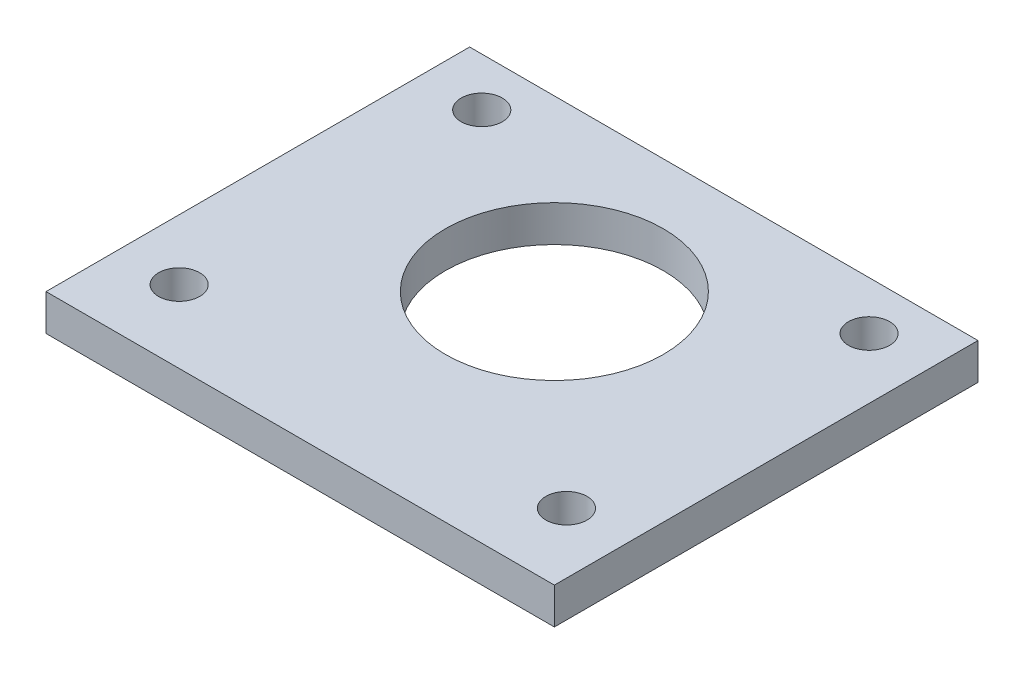
ISO-10303-21;
HEADER;
FILE_DESCRIPTION(('STEP AP214'),'2;1');
FILE_NAME('part.step','',(''),(''),'','','');
FILE_SCHEMA(('AUTOMOTIVE_DESIGN { 1 0 10303 214 1 1 1 1 }'));
ENDSEC;
DATA;
#1=APPLICATION_CONTEXT('core data for automotive mechanical design processes');
#2=APPLICATION_PROTOCOL_DEFINITION('international standard','automotive_design',2000,#1);
#3=PRODUCT_CONTEXT('',#1,'mechanical');
#4=PRODUCT('Part','Part','',(#3));
#5=PRODUCT_RELATED_PRODUCT_CATEGORY('part','',(#4));
#6=PRODUCT_DEFINITION_FORMATION('','',#4);
#7=PRODUCT_DEFINITION_CONTEXT('part definition',#1,'design');
#8=PRODUCT_DEFINITION('design','',#6,#7);
#9=PRODUCT_DEFINITION_SHAPE('','',#8);
#10=(LENGTH_UNIT() NAMED_UNIT(*) SI_UNIT(.MILLI.,.METRE.));
#11=(NAMED_UNIT(*) PLANE_ANGLE_UNIT() SI_UNIT($,.RADIAN.));
#12=(NAMED_UNIT(*) SI_UNIT($,.STERADIAN.) SOLID_ANGLE_UNIT());
#13=UNCERTAINTY_MEASURE_WITH_UNIT(LENGTH_MEASURE(1.E-05),#10,'distance_accuracy_value','');
#14=(GEOMETRIC_REPRESENTATION_CONTEXT(3) GLOBAL_UNCERTAINTY_ASSIGNED_CONTEXT((#13)) GLOBAL_UNIT_ASSIGNED_CONTEXT((#10,
#11,#12)) REPRESENTATION_CONTEXT('',''));
#15=CARTESIAN_POINT('',(0.,0.,0.));
#16=DIRECTION('',(0.,0.,1.));
#17=DIRECTION('',(1.,0.,0.));
#18=AXIS2_PLACEMENT_3D('',#15,#16,#17);
#19=CARTESIAN_POINT('',(42.,0.00630000000001,0.));
#20=DIRECTION('',(0.,1.,0.));
#21=DIRECTION('',(0.,0.,1.));
#22=AXIS2_PLACEMENT_3D('',#19,#20,#21);
#23=PLANE('',#22);
#24=CARTESIAN_POINT('',(5.,0.00630000000001,29.));
#25=DIRECTION('',(0.,1.,0.));
#26=DIRECTION('',(0.,0.,1.));
#27=AXIS2_PLACEMENT_3D('',#24,#25,#26);
#28=CIRCLE('',#27,1.7);
#29=CARTESIAN_POINT('',(5.,0.00630000000001,30.7));
#30=VERTEX_POINT('',#29);
#31=EDGE_CURVE('E93',#30,#30,#28,.T.);
#32=ORIENTED_EDGE('',*,*,#31,.T.);
#33=EDGE_LOOP('',(#32));
#34=FACE_BOUND('',#33,.T.);
#35=CARTESIAN_POINT('',(37.,0.00630000000001,29.));
#36=DIRECTION('',(0.,1.,0.));
#37=DIRECTION('',(0.,0.,1.));
#38=AXIS2_PLACEMENT_3D('',#35,#36,#37);
#39=CIRCLE('',#38,1.7);
#40=CARTESIAN_POINT('',(37.,0.00630000000001,30.7));
#41=VERTEX_POINT('',#40);
#42=EDGE_CURVE('E97',#41,#41,#39,.T.);
#43=ORIENTED_EDGE('',*,*,#42,.T.);
#44=EDGE_LOOP('',(#43));
#45=FACE_BOUND('',#44,.T.);
#46=CARTESIAN_POINT('',(5.,0.00630000000001,4.));
#47=DIRECTION('',(0.,1.,0.));
#48=DIRECTION('',(0.,0.,1.));
#49=AXIS2_PLACEMENT_3D('',#46,#47,#48);
#50=CIRCLE('',#49,1.7);
#51=CARTESIAN_POINT('',(5.,0.00630000000001,5.7));
#52=VERTEX_POINT('',#51);
#53=EDGE_CURVE('E100',#52,#52,#50,.T.);
#54=ORIENTED_EDGE('',*,*,#53,.T.);
#55=EDGE_LOOP('',(#54));
#56=FACE_BOUND('',#55,.T.);
#57=CARTESIAN_POINT('',(21.,0.00630000000001,14.));
#58=DIRECTION('',(0.,1.,0.));
#59=DIRECTION('',(0.,0.,1.));
#60=AXIS2_PLACEMENT_3D('',#57,#58,#59);
#61=CIRCLE('',#60,9.);
#62=CARTESIAN_POINT('',(21.,0.00630000000001,23.));
#63=VERTEX_POINT('',#62);
#64=EDGE_CURVE('E102',#63,#63,#61,.T.);
#65=ORIENTED_EDGE('',*,*,#64,.T.);
#66=EDGE_LOOP('',(#65));
#67=FACE_BOUND('',#66,.T.);
#68=CARTESIAN_POINT('',(37.,0.00630000000001,4.));
#69=DIRECTION('',(0.,1.,0.));
#70=DIRECTION('',(0.,0.,1.));
#71=AXIS2_PLACEMENT_3D('',#68,#69,#70);
#72=CIRCLE('',#71,1.7);
#73=CARTESIAN_POINT('',(37.,0.00630000000001,5.7));
#74=VERTEX_POINT('',#73);
#75=EDGE_CURVE('E19',#74,#74,#72,.T.);
#76=ORIENTED_EDGE('',*,*,#75,.T.);
#77=EDGE_LOOP('',(#76));
#78=FACE_BOUND('',#77,.T.);
#79=DIRECTION('',(0.,0.,1.));
#80=VECTOR('',#79,1.);
#81=CARTESIAN_POINT('',(0.,0.00630000000001,0.));
#82=LINE('',#81,#80);
#83=CARTESIAN_POINT('',(0.,0.00630000000001,0.));
#84=VERTEX_POINT('',#83);
#85=CARTESIAN_POINT('',(0.,0.00630000000001,35.));
#86=VERTEX_POINT('',#85);
#87=EDGE_CURVE('E61',#84,#86,#82,.T.);
#88=ORIENTED_EDGE('',*,*,#87,.F.);
#89=DIRECTION('',(1.,0.,0.));
#90=VECTOR('',#89,1.);
#91=CARTESIAN_POINT('',(42.,0.00630000000001,0.));
#92=LINE('',#91,#90);
#93=CARTESIAN_POINT('',(42.,0.00630000000001,0.));
#94=VERTEX_POINT('',#93);
#95=EDGE_CURVE('E55',#84,#94,#92,.T.);
#96=ORIENTED_EDGE('',*,*,#95,.T.);
#97=DIRECTION('',(0.,0.,1.));
#98=VECTOR('',#97,1.);
#99=CARTESIAN_POINT('',(42.,0.00630000000001,0.));
#100=LINE('',#99,#98);
#101=CARTESIAN_POINT('',(42.,0.00630000000001,35.));
#102=VERTEX_POINT('',#101);
#103=EDGE_CURVE('E59',#94,#102,#100,.T.);
#104=ORIENTED_EDGE('',*,*,#103,.T.);
#105=DIRECTION('',(1.,0.,0.));
#106=VECTOR('',#105,1.);
#107=CARTESIAN_POINT('',(42.,0.00630000000001,35.));
#108=LINE('',#107,#106);
#109=EDGE_CURVE('E111',#86,#102,#108,.T.);
#110=ORIENTED_EDGE('',*,*,#109,.F.);
#111=EDGE_LOOP('',(#88,#96,#104,#110));
#112=FACE_BOUND('',#111,.T.);
#113=ADVANCED_FACE('F16',(#34,#45,#56,#67,#78,#112),#23,.F.);
#114=CARTESIAN_POINT('',(42.,0.00630000000001,0.));
#115=DIRECTION('',(-1.,0.,0.));
#116=DIRECTION('',(0.,0.,1.));
#117=AXIS2_PLACEMENT_3D('',#114,#115,#116);
#118=PLANE('',#117);
#119=DIRECTION('',(0.,1.,0.));
#120=VECTOR('',#119,1.);
#121=CARTESIAN_POINT('',(42.,0.00630000000001,35.));
#122=LINE('',#121,#120);
#123=CARTESIAN_POINT('',(42.,3.0063,35.));
#124=VERTEX_POINT('',#123);
#125=EDGE_CURVE('E69',#102,#124,#122,.T.);
#126=ORIENTED_EDGE('',*,*,#125,.F.);
#127=ORIENTED_EDGE('',*,*,#103,.F.);
#128=DIRECTION('',(0.,1.,0.));
#129=VECTOR('',#128,1.);
#130=CARTESIAN_POINT('',(42.,0.00630000000001,0.));
#131=LINE('',#130,#129);
#132=CARTESIAN_POINT('',(42.,3.0063,0.));
#133=VERTEX_POINT('',#132);
#134=EDGE_CURVE('E63',#94,#133,#131,.T.);
#135=ORIENTED_EDGE('',*,*,#134,.T.);
#136=DIRECTION('',(0.,0.,1.));
#137=VECTOR('',#136,1.);
#138=CARTESIAN_POINT('',(42.,3.0063,0.));
#139=LINE('',#138,#137);
#140=EDGE_CURVE('E96',#124,#133,#139,.F.);
#141=ORIENTED_EDGE('',*,*,#140,.F.);
#142=EDGE_LOOP('',(#126,#127,#135,#141));
#143=FACE_BOUND('',#142,.T.);
#144=ADVANCED_FACE('F66',(#143),#118,.F.);
#145=CARTESIAN_POINT('',(42.,0.00630000000001,0.));
#146=DIRECTION('',(0.,0.,1.));
#147=DIRECTION('',(1.,0.,0.));
#148=AXIS2_PLACEMENT_3D('',#145,#146,#147);
#149=PLANE('',#148);
#150=DIRECTION('',(1.,0.,0.));
#151=VECTOR('',#150,1.);
#152=CARTESIAN_POINT('',(42.,3.0063,0.));
#153=LINE('',#152,#151);
#154=CARTESIAN_POINT('',(0.,3.0063,0.));
#155=VERTEX_POINT('',#154);
#156=EDGE_CURVE('E74',#133,#155,#153,.F.);
#157=ORIENTED_EDGE('',*,*,#156,.F.);
#158=ORIENTED_EDGE('',*,*,#134,.F.);
#159=ORIENTED_EDGE('',*,*,#95,.F.);
#160=DIRECTION('',(0.,1.,0.));
#161=VECTOR('',#160,1.);
#162=CARTESIAN_POINT('',(0.,0.00630000000001,0.));
#163=LINE('',#162,#161);
#164=EDGE_CURVE('E76',#155,#84,#163,.F.);
#165=ORIENTED_EDGE('',*,*,#164,.F.);
#166=EDGE_LOOP('',(#157,#158,#159,#165));
#167=FACE_BOUND('',#166,.T.);
#168=ADVANCED_FACE('F72',(#167),#149,.F.);
#169=CARTESIAN_POINT('',(0.,0.00630000000001,0.));
#170=DIRECTION('',(-1.,0.,0.));
#171=DIRECTION('',(0.,0.,1.));
#172=AXIS2_PLACEMENT_3D('',#169,#170,#171);
#173=PLANE('',#172);
#174=DIRECTION('',(0.,1.,0.));
#175=VECTOR('',#174,1.);
#176=CARTESIAN_POINT('',(0.,0.00630000000001,35.));
#177=LINE('',#176,#175);
#178=CARTESIAN_POINT('',(0.,3.0063,35.));
#179=VERTEX_POINT('',#178);
#180=EDGE_CURVE('E34',#179,#86,#177,.F.);
#181=ORIENTED_EDGE('',*,*,#180,.F.);
#182=DIRECTION('',(0.,0.,1.));
#183=VECTOR('',#182,1.);
#184=CARTESIAN_POINT('',(0.,3.0063,0.));
#185=LINE('',#184,#183);
#186=EDGE_CURVE('E118',#155,#179,#185,.T.);
#187=ORIENTED_EDGE('',*,*,#186,.F.);
#188=ORIENTED_EDGE('',*,*,#164,.T.);
#189=ORIENTED_EDGE('',*,*,#87,.T.);
#190=EDGE_LOOP('',(#181,#187,#188,#189));
#191=FACE_BOUND('',#190,.T.);
#192=ADVANCED_FACE('F116',(#191),#173,.T.);
#193=CARTESIAN_POINT('',(42.,0.00630000000001,35.));
#194=DIRECTION('',(0.,0.,1.));
#195=DIRECTION('',(1.,0.,0.));
#196=AXIS2_PLACEMENT_3D('',#193,#194,#195);
#197=PLANE('',#196);
#198=DIRECTION('',(1.,0.,0.));
#199=VECTOR('',#198,1.);
#200=CARTESIAN_POINT('',(42.,3.0063,35.));
#201=LINE('',#200,#199);
#202=EDGE_CURVE('E92',#179,#124,#201,.T.);
#203=ORIENTED_EDGE('',*,*,#202,.F.);
#204=ORIENTED_EDGE('',*,*,#180,.T.);
#205=ORIENTED_EDGE('',*,*,#109,.T.);
#206=ORIENTED_EDGE('',*,*,#125,.T.);
#207=EDGE_LOOP('',(#203,#204,#205,#206));
#208=FACE_BOUND('',#207,.T.);
#209=ADVANCED_FACE('F124',(#208),#197,.T.);
#210=CARTESIAN_POINT('',(37.,0.00630000000001,4.));
#211=DIRECTION('',(0.,1.,0.));
#212=DIRECTION('',(0.,0.,1.));
#213=AXIS2_PLACEMENT_3D('',#210,#211,#212);
#214=CYLINDRICAL_SURFACE('',#213,1.7);
#215=ORIENTED_EDGE('',*,*,#75,.F.);
#216=EDGE_LOOP('',(#215));
#217=FACE_BOUND('',#216,.T.);
#218=CARTESIAN_POINT('',(37.,3.0063,4.));
#219=DIRECTION('',(0.,1.,0.));
#220=DIRECTION('',(0.,0.,1.));
#221=AXIS2_PLACEMENT_3D('',#218,#219,#220);
#222=CIRCLE('',#221,1.7);
#223=CARTESIAN_POINT('',(37.,3.0063,5.7));
#224=VERTEX_POINT('',#223);
#225=EDGE_CURVE('E89',#224,#224,#222,.F.);
#226=ORIENTED_EDGE('',*,*,#225,.F.);
#227=EDGE_LOOP('',(#226));
#228=FACE_BOUND('',#227,.T.);
#229=ADVANCED_FACE('F126',(#217,#228),#214,.F.);
#230=CARTESIAN_POINT('',(21.,0.00630000000001,14.));
#231=DIRECTION('',(0.,1.,0.));
#232=DIRECTION('',(0.,0.,1.));
#233=AXIS2_PLACEMENT_3D('',#230,#231,#232);
#234=CYLINDRICAL_SURFACE('',#233,9.);
#235=ORIENTED_EDGE('',*,*,#64,.F.);
#236=EDGE_LOOP('',(#235));
#237=FACE_BOUND('',#236,.T.);
#238=CARTESIAN_POINT('',(21.,3.0063,14.));
#239=DIRECTION('',(0.,1.,0.));
#240=DIRECTION('',(0.,0.,1.));
#241=AXIS2_PLACEMENT_3D('',#238,#239,#240);
#242=CIRCLE('',#241,9.);
#243=CARTESIAN_POINT('',(21.,3.0063,23.));
#244=VERTEX_POINT('',#243);
#245=EDGE_CURVE('E86',#244,#244,#242,.F.);
#246=ORIENTED_EDGE('',*,*,#245,.F.);
#247=EDGE_LOOP('',(#246));
#248=FACE_BOUND('',#247,.T.);
#249=ADVANCED_FACE('F133',(#237,#248),#234,.F.);
#250=CARTESIAN_POINT('',(5.,0.00630000000001,4.));
#251=DIRECTION('',(0.,1.,0.));
#252=DIRECTION('',(0.,0.,1.));
#253=AXIS2_PLACEMENT_3D('',#250,#251,#252);
#254=CYLINDRICAL_SURFACE('',#253,1.7);
#255=ORIENTED_EDGE('',*,*,#53,.F.);
#256=EDGE_LOOP('',(#255));
#257=FACE_BOUND('',#256,.T.);
#258=CARTESIAN_POINT('',(5.,3.0063,4.));
#259=DIRECTION('',(0.,1.,0.));
#260=DIRECTION('',(0.,0.,1.));
#261=AXIS2_PLACEMENT_3D('',#258,#259,#260);
#262=CIRCLE('',#261,1.7);
#263=CARTESIAN_POINT('',(5.,3.0063,5.7));
#264=VERTEX_POINT('',#263);
#265=EDGE_CURVE('E83',#264,#264,#262,.F.);
#266=ORIENTED_EDGE('',*,*,#265,.F.);
#267=EDGE_LOOP('',(#266));
#268=FACE_BOUND('',#267,.T.);
#269=ADVANCED_FACE('F151',(#257,#268),#254,.F.);
#270=CARTESIAN_POINT('',(37.,0.00630000000001,29.));
#271=DIRECTION('',(0.,1.,0.));
#272=DIRECTION('',(0.,0.,1.));
#273=AXIS2_PLACEMENT_3D('',#270,#271,#272);
#274=CYLINDRICAL_SURFACE('',#273,1.7);
#275=ORIENTED_EDGE('',*,*,#42,.F.);
#276=EDGE_LOOP('',(#275));
#277=FACE_BOUND('',#276,.T.);
#278=CARTESIAN_POINT('',(37.,3.0063,29.));
#279=DIRECTION('',(0.,1.,0.));
#280=DIRECTION('',(0.,0.,1.));
#281=AXIS2_PLACEMENT_3D('',#278,#279,#280);
#282=CIRCLE('',#281,1.7);
#283=CARTESIAN_POINT('',(37.,3.0063,30.7));
#284=VERTEX_POINT('',#283);
#285=EDGE_CURVE('E25',#284,#284,#282,.F.);
#286=ORIENTED_EDGE('',*,*,#285,.F.);
#287=EDGE_LOOP('',(#286));
#288=FACE_BOUND('',#287,.T.);
#289=ADVANCED_FACE('F144',(#277,#288),#274,.F.);
#290=CARTESIAN_POINT('',(5.,0.00630000000001,29.));
#291=DIRECTION('',(0.,1.,0.));
#292=DIRECTION('',(0.,0.,1.));
#293=AXIS2_PLACEMENT_3D('',#290,#291,#292);
#294=CYLINDRICAL_SURFACE('',#293,1.7);
#295=ORIENTED_EDGE('',*,*,#31,.F.);
#296=EDGE_LOOP('',(#295));
#297=FACE_BOUND('',#296,.T.);
#298=CARTESIAN_POINT('',(5.,3.0063,29.));
#299=DIRECTION('',(0.,1.,0.));
#300=DIRECTION('',(0.,0.,1.));
#301=AXIS2_PLACEMENT_3D('',#298,#299,#300);
#302=CIRCLE('',#301,1.7);
#303=CARTESIAN_POINT('',(5.,3.0063,30.7));
#304=VERTEX_POINT('',#303);
#305=EDGE_CURVE('E11',#304,#304,#302,.F.);
#306=ORIENTED_EDGE('',*,*,#305,.F.);
#307=EDGE_LOOP('',(#306));
#308=FACE_BOUND('',#307,.T.);
#309=ADVANCED_FACE('F138',(#297,#308),#294,.F.);
#310=CARTESIAN_POINT('',(42.,3.0063,0.));
#311=DIRECTION('',(0.,1.,0.));
#312=DIRECTION('',(0.,0.,1.));
#313=AXIS2_PLACEMENT_3D('',#310,#311,#312);
#314=PLANE('',#313);
#315=ORIENTED_EDGE('',*,*,#305,.T.);
#316=EDGE_LOOP('',(#315));
#317=FACE_BOUND('',#316,.T.);
#318=ORIENTED_EDGE('',*,*,#285,.T.);
#319=EDGE_LOOP('',(#318));
#320=FACE_BOUND('',#319,.T.);
#321=ORIENTED_EDGE('',*,*,#265,.T.);
#322=EDGE_LOOP('',(#321));
#323=FACE_BOUND('',#322,.T.);
#324=ORIENTED_EDGE('',*,*,#245,.T.);
#325=EDGE_LOOP('',(#324));
#326=FACE_BOUND('',#325,.T.);
#327=ORIENTED_EDGE('',*,*,#225,.T.);
#328=EDGE_LOOP('',(#327));
#329=FACE_BOUND('',#328,.T.);
#330=ORIENTED_EDGE('',*,*,#186,.T.);
#331=ORIENTED_EDGE('',*,*,#202,.T.);
#332=ORIENTED_EDGE('',*,*,#140,.T.);
#333=ORIENTED_EDGE('',*,*,#156,.T.);
#334=EDGE_LOOP('',(#330,#331,#332,#333));
#335=FACE_BOUND('',#334,.T.);
#336=ADVANCED_FACE('F122',(#317,#320,#323,#326,#329,#335),#314,.T.);
#337=CLOSED_SHELL('',(#113,#144,#168,#192,#209,#229,#249,#269,#289,#309,#336));
#338=MANIFOLD_SOLID_BREP('B1',#337);
#339=ADVANCED_BREP_SHAPE_REPRESENTATION('',(#18,#338),#14);
#340=SHAPE_DEFINITION_REPRESENTATION(#9,#339);
ENDSEC;
END-ISO-10303-21;
